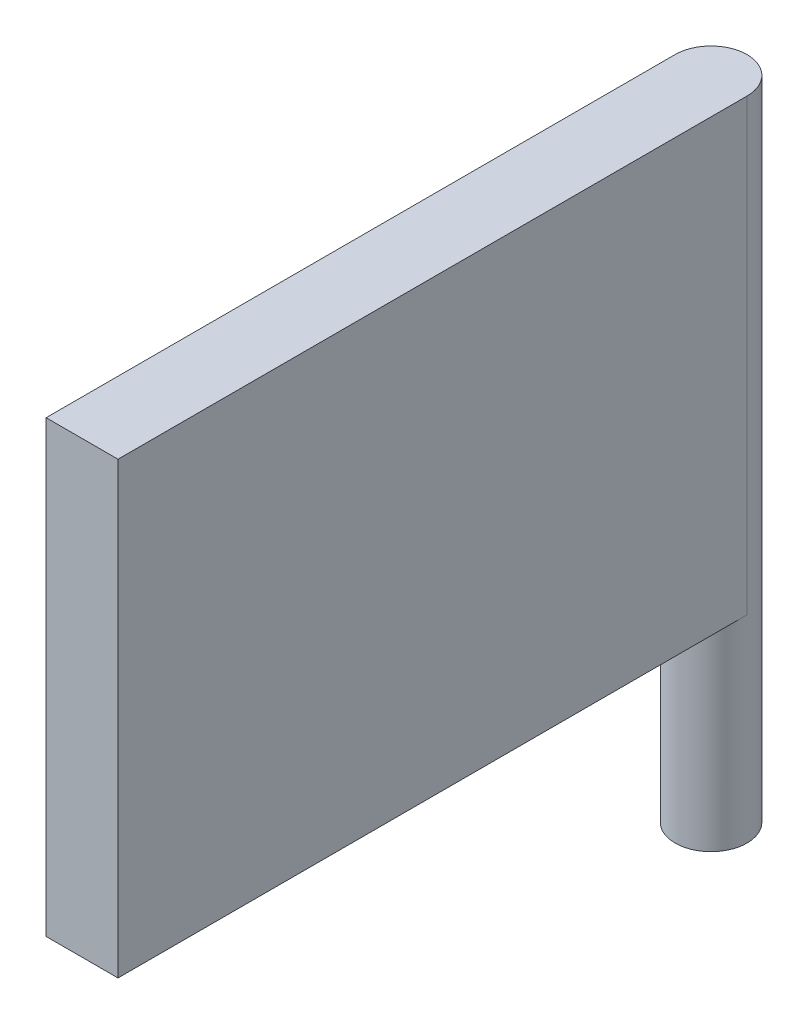
ISO-10303-21;
HEADER;
FILE_DESCRIPTION(('STEP AP214'),'2;1');
FILE_NAME('part.step','',(''),(''),'','','');
FILE_SCHEMA(('AUTOMOTIVE_DESIGN { 1 0 10303 214 1 1 1 1 }'));
ENDSEC;
DATA;
#1=APPLICATION_CONTEXT('core data for automotive mechanical design processes');
#2=APPLICATION_PROTOCOL_DEFINITION('international standard','automotive_design',2000,#1);
#3=PRODUCT_CONTEXT('',#1,'mechanical');
#4=PRODUCT('Part','Part','',(#3));
#5=PRODUCT_RELATED_PRODUCT_CATEGORY('part','',(#4));
#6=PRODUCT_DEFINITION_FORMATION('','',#4);
#7=PRODUCT_DEFINITION_CONTEXT('part definition',#1,'design');
#8=PRODUCT_DEFINITION('design','',#6,#7);
#9=PRODUCT_DEFINITION_SHAPE('','',#8);
#10=(LENGTH_UNIT() NAMED_UNIT(*) SI_UNIT(.MILLI.,.METRE.));
#11=(NAMED_UNIT(*) PLANE_ANGLE_UNIT() SI_UNIT($,.RADIAN.));
#12=(NAMED_UNIT(*) SI_UNIT($,.STERADIAN.) SOLID_ANGLE_UNIT());
#13=UNCERTAINTY_MEASURE_WITH_UNIT(LENGTH_MEASURE(1.E-05),#10,'distance_accuracy_value','');
#14=(GEOMETRIC_REPRESENTATION_CONTEXT(3) GLOBAL_UNCERTAINTY_ASSIGNED_CONTEXT((#13)) GLOBAL_UNIT_ASSIGNED_CONTEXT((#10,
#11,#12)) REPRESENTATION_CONTEXT('',''));
#15=CARTESIAN_POINT('',(0.,0.,0.));
#16=DIRECTION('',(0.,0.,1.));
#17=DIRECTION('',(1.,0.,0.));
#18=AXIS2_PLACEMENT_3D('',#15,#16,#17);
#19=CARTESIAN_POINT('',(0.,72.,0.));
#20=DIRECTION('',(0.,-1.,0.));
#21=DIRECTION('',(0.,0.,-1.));
#22=AXIS2_PLACEMENT_3D('',#19,#20,#21);
#23=CYLINDRICAL_SURFACE('',#22,4.);
#24=CARTESIAN_POINT('',(0.,0.,0.));
#25=DIRECTION('',(0.,1.,0.));
#26=DIRECTION('',(0.,0.,1.));
#27=AXIS2_PLACEMENT_3D('',#24,#25,#26);
#28=CIRCLE('',#27,4.);
#29=CARTESIAN_POINT('',(0.,0.,4.));
#30=VERTEX_POINT('',#29);
#31=EDGE_CURVE('E101',#30,#30,#28,.T.);
#32=ORIENTED_EDGE('',*,*,#31,.T.);
#33=EDGE_LOOP('',(#32));
#34=FACE_BOUND('',#33,.T.);
#35=DIRECTION('',(0.,-1.,0.));
#36=VECTOR('',#35,1.);
#37=CARTESIAN_POINT('',(-4.,72.,0.));
#38=LINE('',#37,#36);
#39=CARTESIAN_POINT('',(-4.,72.,0.));
#40=VERTEX_POINT('',#39);
#41=CARTESIAN_POINT('',(-4.,22.,0.));
#42=VERTEX_POINT('',#41);
#43=EDGE_CURVE('E99',#40,#42,#38,.T.);
#44=ORIENTED_EDGE('',*,*,#43,.F.);
#45=CARTESIAN_POINT('',(0.,72.,0.));
#46=DIRECTION('',(0.,1.,0.));
#47=DIRECTION('',(0.,0.,1.));
#48=AXIS2_PLACEMENT_3D('',#45,#46,#47);
#49=CIRCLE('',#48,4.);
#50=CARTESIAN_POINT('',(4.,72.,0.));
#51=VERTEX_POINT('',#50);
#52=EDGE_CURVE('E47',#51,#40,#49,.T.);
#53=ORIENTED_EDGE('',*,*,#52,.F.);
#54=DIRECTION('',(0.,1.,0.));
#55=VECTOR('',#54,1.);
#56=CARTESIAN_POINT('',(4.,72.,0.));
#57=LINE('',#56,#55);
#58=CARTESIAN_POINT('',(4.,22.,0.));
#59=VERTEX_POINT('',#58);
#60=EDGE_CURVE('E57',#59,#51,#57,.T.);
#61=ORIENTED_EDGE('',*,*,#60,.F.);
#62=CARTESIAN_POINT('',(0.,22.,0.));
#63=DIRECTION('',(0.,1.,0.));
#64=DIRECTION('',(0.,0.,1.));
#65=AXIS2_PLACEMENT_3D('',#62,#63,#64);
#66=CIRCLE('',#65,4.);
#67=EDGE_CURVE('E11',#42,#59,#66,.T.);
#68=ORIENTED_EDGE('',*,*,#67,.F.);
#69=EDGE_LOOP('',(#44,#53,#61,#68));
#70=FACE_BOUND('',#69,.T.);
#71=ADVANCED_FACE('F39',(#34,#70),#23,.T.);
#72=CARTESIAN_POINT('',(0.,72.,0.));
#73=DIRECTION('',(0.,1.,0.));
#74=DIRECTION('',(0.,0.,1.));
#75=AXIS2_PLACEMENT_3D('',#72,#73,#74);
#76=PLANE('',#75);
#77=ORIENTED_EDGE('',*,*,#52,.T.);
#78=DIRECTION('',(0.,0.,-1.));
#79=VECTOR('',#78,1.);
#80=CARTESIAN_POINT('',(-4.,72.,70.));
#81=LINE('',#80,#79);
#82=CARTESIAN_POINT('',(-4.,72.,70.));
#83=VERTEX_POINT('',#82);
#84=EDGE_CURVE('E115',#83,#40,#81,.T.);
#85=ORIENTED_EDGE('',*,*,#84,.F.);
#86=DIRECTION('',(-1.,0.,0.));
#87=VECTOR('',#86,1.);
#88=CARTESIAN_POINT('',(-4.,72.,70.));
#89=LINE('',#88,#87);
#90=CARTESIAN_POINT('',(4.,72.,70.));
#91=VERTEX_POINT('',#90);
#92=EDGE_CURVE('E92',#91,#83,#89,.T.);
#93=ORIENTED_EDGE('',*,*,#92,.F.);
#94=DIRECTION('',(0.,0.,-1.));
#95=VECTOR('',#94,1.);
#96=CARTESIAN_POINT('',(4.,72.,70.));
#97=LINE('',#96,#95);
#98=EDGE_CURVE('E106',#91,#51,#97,.T.);
#99=ORIENTED_EDGE('',*,*,#98,.T.);
#100=EDGE_LOOP('',(#77,#85,#93,#99));
#101=FACE_BOUND('',#100,.T.);
#102=ADVANCED_FACE('F114',(#101),#76,.T.);
#103=CARTESIAN_POINT('',(0.,0.,0.));
#104=DIRECTION('',(0.,1.,0.));
#105=DIRECTION('',(0.,0.,1.));
#106=AXIS2_PLACEMENT_3D('',#103,#104,#105);
#107=PLANE('',#106);
#108=ORIENTED_EDGE('',*,*,#31,.F.);
#109=EDGE_LOOP('',(#108));
#110=FACE_BOUND('',#109,.T.);
#111=ADVANCED_FACE('F143',(#110),#107,.F.);
#112=CARTESIAN_POINT('',(-4.,72.,70.));
#113=DIRECTION('',(1.,0.,0.));
#114=DIRECTION('',(0.,1.,0.));
#115=AXIS2_PLACEMENT_3D('',#112,#113,#114);
#116=PLANE('',#115);
#117=ORIENTED_EDGE('',*,*,#43,.T.);
#118=DIRECTION('',(0.,0.,-1.));
#119=VECTOR('',#118,1.);
#120=CARTESIAN_POINT('',(-3.99999999999999,22.,70.));
#121=LINE('',#120,#119);
#122=CARTESIAN_POINT('',(-3.99999999999999,22.,70.));
#123=VERTEX_POINT('',#122);
#124=EDGE_CURVE('E79',#123,#42,#121,.T.);
#125=ORIENTED_EDGE('',*,*,#124,.F.);
#126=DIRECTION('',(0.,-1.,0.));
#127=VECTOR('',#126,1.);
#128=CARTESIAN_POINT('',(-4.,72.,70.));
#129=LINE('',#128,#127);
#130=EDGE_CURVE('E87',#83,#123,#129,.T.);
#131=ORIENTED_EDGE('',*,*,#130,.F.);
#132=ORIENTED_EDGE('',*,*,#84,.T.);
#133=EDGE_LOOP('',(#117,#125,#131,#132));
#134=FACE_BOUND('',#133,.T.);
#135=ADVANCED_FACE('F98',(#134),#116,.F.);
#136=CARTESIAN_POINT('',(-3.99999999999999,22.,70.));
#137=DIRECTION('',(0.,1.,0.));
#138=DIRECTION('',(0.,0.,1.));
#139=AXIS2_PLACEMENT_3D('',#136,#137,#138);
#140=PLANE('',#139);
#141=ORIENTED_EDGE('',*,*,#124,.T.);
#142=ORIENTED_EDGE('',*,*,#67,.T.);
#143=DIRECTION('',(0.,0.,-1.));
#144=VECTOR('',#143,1.);
#145=CARTESIAN_POINT('',(4.,22.,70.));
#146=LINE('',#145,#144);
#147=CARTESIAN_POINT('',(4.,22.,70.));
#148=VERTEX_POINT('',#147);
#149=EDGE_CURVE('E82',#148,#59,#146,.T.);
#150=ORIENTED_EDGE('',*,*,#149,.F.);
#151=DIRECTION('',(1.,0.,0.));
#152=VECTOR('',#151,1.);
#153=CARTESIAN_POINT('',(-3.99999999999999,22.,70.));
#154=LINE('',#153,#152);
#155=EDGE_CURVE('E75',#123,#148,#154,.T.);
#156=ORIENTED_EDGE('',*,*,#155,.F.);
#157=EDGE_LOOP('',(#141,#142,#150,#156));
#158=FACE_BOUND('',#157,.T.);
#159=ADVANCED_FACE('F77',(#158),#140,.F.);
#160=CARTESIAN_POINT('',(4.,72.,70.));
#161=DIRECTION('',(-1.,0.,0.));
#162=DIRECTION('',(0.,0.,1.));
#163=AXIS2_PLACEMENT_3D('',#160,#161,#162);
#164=PLANE('',#163);
#165=ORIENTED_EDGE('',*,*,#60,.T.);
#166=ORIENTED_EDGE('',*,*,#98,.F.);
#167=DIRECTION('',(0.,1.,0.));
#168=VECTOR('',#167,1.);
#169=CARTESIAN_POINT('',(4.,72.,70.));
#170=LINE('',#169,#168);
#171=EDGE_CURVE('E86',#148,#91,#170,.T.);
#172=ORIENTED_EDGE('',*,*,#171,.F.);
#173=ORIENTED_EDGE('',*,*,#149,.T.);
#174=EDGE_LOOP('',(#165,#166,#172,#173));
#175=FACE_BOUND('',#174,.T.);
#176=ADVANCED_FACE('F129',(#175),#164,.F.);
#177=CARTESIAN_POINT('',(0.,0.,70.));
#178=DIRECTION('',(0.,0.,1.));
#179=DIRECTION('',(1.,0.,0.));
#180=AXIS2_PLACEMENT_3D('',#177,#178,#179);
#181=PLANE('',#180);
#182=ORIENTED_EDGE('',*,*,#130,.T.);
#183=ORIENTED_EDGE('',*,*,#155,.T.);
#184=ORIENTED_EDGE('',*,*,#171,.T.);
#185=ORIENTED_EDGE('',*,*,#92,.T.);
#186=EDGE_LOOP('',(#182,#183,#184,#185));
#187=FACE_BOUND('',#186,.T.);
#188=ADVANCED_FACE('F90',(#187),#181,.T.);
#189=CLOSED_SHELL('',(#71,#102,#111,#135,#159,#176,#188));
#190=MANIFOLD_SOLID_BREP('B2',#189);
#191=ADVANCED_BREP_SHAPE_REPRESENTATION('',(#18,#190),#14);
#192=SHAPE_DEFINITION_REPRESENTATION(#9,#191);
ENDSEC;
END-ISO-10303-21;
